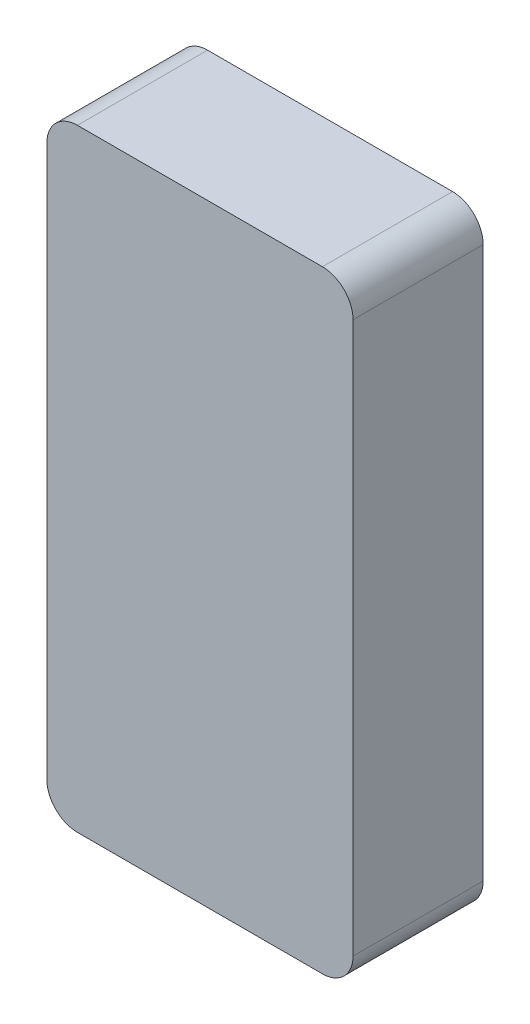
ISO-10303-21;
HEADER;
FILE_DESCRIPTION(('STEP AP214'),'2;1');
FILE_NAME('part.step','',(''),(''),'','','');
FILE_SCHEMA(('AUTOMOTIVE_DESIGN { 1 0 10303 214 1 1 1 1 }'));
ENDSEC;
DATA;
#1=APPLICATION_CONTEXT('core data for automotive mechanical design processes');
#2=APPLICATION_PROTOCOL_DEFINITION('international standard','automotive_design',2000,#1);
#3=PRODUCT_CONTEXT('',#1,'mechanical');
#4=PRODUCT('Part','Part','',(#3));
#5=PRODUCT_RELATED_PRODUCT_CATEGORY('part','',(#4));
#6=PRODUCT_DEFINITION_FORMATION('','',#4);
#7=PRODUCT_DEFINITION_CONTEXT('part definition',#1,'design');
#8=PRODUCT_DEFINITION('design','',#6,#7);
#9=PRODUCT_DEFINITION_SHAPE('','',#8);
#10=(LENGTH_UNIT() NAMED_UNIT(*) SI_UNIT(.MILLI.,.METRE.));
#11=(NAMED_UNIT(*) PLANE_ANGLE_UNIT() SI_UNIT($,.RADIAN.));
#12=(NAMED_UNIT(*) SI_UNIT($,.STERADIAN.) SOLID_ANGLE_UNIT());
#13=UNCERTAINTY_MEASURE_WITH_UNIT(LENGTH_MEASURE(1.E-05),#10,'distance_accuracy_value','');
#14=(GEOMETRIC_REPRESENTATION_CONTEXT(3) GLOBAL_UNCERTAINTY_ASSIGNED_CONTEXT((#13)) GLOBAL_UNIT_ASSIGNED_CONTEXT((#10,
#11,#12)) REPRESENTATION_CONTEXT('',''));
#15=CARTESIAN_POINT('',(0.,0.,0.));
#16=DIRECTION('',(0.,0.,1.));
#17=DIRECTION('',(1.,0.,0.));
#18=AXIS2_PLACEMENT_3D('',#15,#16,#17);
#19=CARTESIAN_POINT('',(-10.,20.,8.5));
#20=DIRECTION('',(1.,0.,0.));
#21=DIRECTION('',(0.,0.,-1.));
#22=AXIS2_PLACEMENT_3D('',#19,#20,#21);
#23=PLANE('',#22);
#24=DIRECTION('',(0.,-1.,0.));
#25=VECTOR('',#24,1.);
#26=CARTESIAN_POINT('',(-10.,20.,0.));
#27=LINE('',#26,#25);
#28=CARTESIAN_POINT('',(-10.,18.,0.));
#29=VERTEX_POINT('',#28);
#30=CARTESIAN_POINT('',(-10.,-18.,0.));
#31=VERTEX_POINT('',#30);
#32=EDGE_CURVE('E124',#29,#31,#27,.T.);
#33=ORIENTED_EDGE('',*,*,#32,.T.);
#34=DIRECTION('',(0.,0.,-1.));
#35=VECTOR('',#34,1.);
#36=CARTESIAN_POINT('',(-10.,-18.,8.5));
#37=LINE('',#36,#35);
#38=CARTESIAN_POINT('',(-10.,-18.,8.5));
#39=VERTEX_POINT('',#38);
#40=EDGE_CURVE('E102',#31,#39,#37,.F.);
#41=ORIENTED_EDGE('',*,*,#40,.T.);
#42=DIRECTION('',(0.,-1.,0.));
#43=VECTOR('',#42,1.);
#44=CARTESIAN_POINT('',(-10.,20.,8.5));
#45=LINE('',#44,#43);
#46=CARTESIAN_POINT('',(-10.,18.,8.5));
#47=VERTEX_POINT('',#46);
#48=EDGE_CURVE('E133',#47,#39,#45,.T.);
#49=ORIENTED_EDGE('',*,*,#48,.F.);
#50=DIRECTION('',(0.,0.,-1.));
#51=VECTOR('',#50,1.);
#52=CARTESIAN_POINT('',(-10.,18.,8.5));
#53=LINE('',#52,#51);
#54=EDGE_CURVE('E107',#47,#29,#53,.T.);
#55=ORIENTED_EDGE('',*,*,#54,.T.);
#56=EDGE_LOOP('',(#33,#41,#49,#55));
#57=FACE_BOUND('',#56,.T.);
#58=ADVANCED_FACE('F32',(#57),#23,.F.);
#59=CARTESIAN_POINT('',(-10.,-20.,8.5));
#60=DIRECTION('',(0.,1.,0.));
#61=DIRECTION('',(0.,0.,1.));
#62=AXIS2_PLACEMENT_3D('',#59,#60,#61);
#63=PLANE('',#62);
#64=DIRECTION('',(1.,0.,0.));
#65=VECTOR('',#64,1.);
#66=CARTESIAN_POINT('',(-10.,-20.,8.5));
#67=LINE('',#66,#65);
#68=CARTESIAN_POINT('',(-8.,-20.,8.5));
#69=VERTEX_POINT('',#68);
#70=CARTESIAN_POINT('',(8.,-20.,8.5));
#71=VERTEX_POINT('',#70);
#72=EDGE_CURVE('E117',#69,#71,#67,.T.);
#73=ORIENTED_EDGE('',*,*,#72,.F.);
#74=DIRECTION('',(0.,0.,-1.));
#75=VECTOR('',#74,1.);
#76=CARTESIAN_POINT('',(-8.,-20.,8.5));
#77=LINE('',#76,#75);
#78=CARTESIAN_POINT('',(-8.,-20.,0.));
#79=VERTEX_POINT('',#78);
#80=EDGE_CURVE('E101',#69,#79,#77,.T.);
#81=ORIENTED_EDGE('',*,*,#80,.T.);
#82=DIRECTION('',(1.,0.,0.));
#83=VECTOR('',#82,1.);
#84=CARTESIAN_POINT('',(-10.,-20.,0.));
#85=LINE('',#84,#83);
#86=CARTESIAN_POINT('',(8.,-20.,0.));
#87=VERTEX_POINT('',#86);
#88=EDGE_CURVE('E114',#79,#87,#85,.T.);
#89=ORIENTED_EDGE('',*,*,#88,.T.);
#90=DIRECTION('',(0.,0.,-1.));
#91=VECTOR('',#90,1.);
#92=CARTESIAN_POINT('',(8.,-20.,8.5));
#93=LINE('',#92,#91);
#94=EDGE_CURVE('E119',#87,#71,#93,.F.);
#95=ORIENTED_EDGE('',*,*,#94,.T.);
#96=EDGE_LOOP('',(#73,#81,#89,#95));
#97=FACE_BOUND('',#96,.T.);
#98=ADVANCED_FACE('F113',(#97),#63,.F.);
#99=CARTESIAN_POINT('',(10.,20.,8.5));
#100=DIRECTION('',(-1.,0.,0.));
#101=DIRECTION('',(0.,0.,1.));
#102=AXIS2_PLACEMENT_3D('',#99,#100,#101);
#103=PLANE('',#102);
#104=DIRECTION('',(0.,1.,0.));
#105=VECTOR('',#104,1.);
#106=CARTESIAN_POINT('',(10.,20.,8.5));
#107=LINE('',#106,#105);
#108=CARTESIAN_POINT('',(10.,-18.,8.5));
#109=VERTEX_POINT('',#108);
#110=CARTESIAN_POINT('',(10.,18.,8.5));
#111=VERTEX_POINT('',#110);
#112=EDGE_CURVE('E167',#109,#111,#107,.T.);
#113=ORIENTED_EDGE('',*,*,#112,.F.);
#114=DIRECTION('',(0.,0.,-1.));
#115=VECTOR('',#114,1.);
#116=CARTESIAN_POINT('',(10.,-18.,8.5));
#117=LINE('',#116,#115);
#118=CARTESIAN_POINT('',(10.,-18.,0.));
#119=VERTEX_POINT('',#118);
#120=EDGE_CURVE('E152',#109,#119,#117,.T.);
#121=ORIENTED_EDGE('',*,*,#120,.T.);
#122=DIRECTION('',(0.,1.,0.));
#123=VECTOR('',#122,1.);
#124=CARTESIAN_POINT('',(10.,20.,0.));
#125=LINE('',#124,#123);
#126=CARTESIAN_POINT('',(10.,18.,0.));
#127=VERTEX_POINT('',#126);
#128=EDGE_CURVE('E123',#119,#127,#125,.T.);
#129=ORIENTED_EDGE('',*,*,#128,.T.);
#130=DIRECTION('',(0.,0.,-1.));
#131=VECTOR('',#130,1.);
#132=CARTESIAN_POINT('',(10.,18.,8.5));
#133=LINE('',#132,#131);
#134=EDGE_CURVE('E150',#127,#111,#133,.F.);
#135=ORIENTED_EDGE('',*,*,#134,.T.);
#136=EDGE_LOOP('',(#113,#121,#129,#135));
#137=FACE_BOUND('',#136,.T.);
#138=ADVANCED_FACE('F178',(#137),#103,.F.);
#139=CARTESIAN_POINT('',(-10.,20.,8.5));
#140=DIRECTION('',(0.,-1.,0.));
#141=DIRECTION('',(0.,0.,-1.));
#142=AXIS2_PLACEMENT_3D('',#139,#140,#141);
#143=PLANE('',#142);
#144=DIRECTION('',(-1.,0.,0.));
#145=VECTOR('',#144,1.);
#146=CARTESIAN_POINT('',(-10.,20.,0.));
#147=LINE('',#146,#145);
#148=CARTESIAN_POINT('',(8.,20.,0.));
#149=VERTEX_POINT('',#148);
#150=CARTESIAN_POINT('',(-8.,20.,0.));
#151=VERTEX_POINT('',#150);
#152=EDGE_CURVE('E127',#149,#151,#147,.T.);
#153=ORIENTED_EDGE('',*,*,#152,.T.);
#154=DIRECTION('',(0.,0.,-1.));
#155=VECTOR('',#154,1.);
#156=CARTESIAN_POINT('',(-8.,20.,8.5));
#157=LINE('',#156,#155);
#158=CARTESIAN_POINT('',(-8.,20.,8.5));
#159=VERTEX_POINT('',#158);
#160=EDGE_CURVE('E11',#151,#159,#157,.F.);
#161=ORIENTED_EDGE('',*,*,#160,.T.);
#162=DIRECTION('',(-1.,0.,0.));
#163=VECTOR('',#162,1.);
#164=CARTESIAN_POINT('',(-10.,20.,8.5));
#165=LINE('',#164,#163);
#166=CARTESIAN_POINT('',(8.,20.,8.5));
#167=VERTEX_POINT('',#166);
#168=EDGE_CURVE('E134',#167,#159,#165,.T.);
#169=ORIENTED_EDGE('',*,*,#168,.F.);
#170=DIRECTION('',(0.,0.,-1.));
#171=VECTOR('',#170,1.);
#172=CARTESIAN_POINT('',(8.,20.,8.5));
#173=LINE('',#172,#171);
#174=EDGE_CURVE('E40',#167,#149,#173,.T.);
#175=ORIENTED_EDGE('',*,*,#174,.T.);
#176=EDGE_LOOP('',(#153,#161,#169,#175));
#177=FACE_BOUND('',#176,.T.);
#178=ADVANCED_FACE('F157',(#177),#143,.F.);
#179=CARTESIAN_POINT('',(0.,0.,8.5));
#180=DIRECTION('',(0.,0.,1.));
#181=DIRECTION('',(1.,0.,0.));
#182=AXIS2_PLACEMENT_3D('',#179,#180,#181);
#183=PLANE('',#182);
#184=ORIENTED_EDGE('',*,*,#48,.T.);
#185=CARTESIAN_POINT('',(-8.,-18.,8.5));
#186=DIRECTION('',(0.,0.,1.));
#187=DIRECTION('',(1.,0.,0.));
#188=AXIS2_PLACEMENT_3D('',#185,#186,#187);
#189=CIRCLE('',#188,2.);
#190=EDGE_CURVE('E148',#39,#69,#189,.T.);
#191=ORIENTED_EDGE('',*,*,#190,.T.);
#192=ORIENTED_EDGE('',*,*,#72,.T.);
#193=CARTESIAN_POINT('',(8.,-18.,8.5));
#194=DIRECTION('',(0.,0.,1.));
#195=DIRECTION('',(1.,0.,0.));
#196=AXIS2_PLACEMENT_3D('',#193,#194,#195);
#197=CIRCLE('',#196,2.);
#198=EDGE_CURVE('E146',#71,#109,#197,.T.);
#199=ORIENTED_EDGE('',*,*,#198,.T.);
#200=ORIENTED_EDGE('',*,*,#112,.T.);
#201=CARTESIAN_POINT('',(8.,18.,8.5));
#202=DIRECTION('',(0.,0.,1.));
#203=DIRECTION('',(1.,0.,0.));
#204=AXIS2_PLACEMENT_3D('',#201,#202,#203);
#205=CIRCLE('',#204,2.);
#206=EDGE_CURVE('E52',#111,#167,#205,.T.);
#207=ORIENTED_EDGE('',*,*,#206,.T.);
#208=ORIENTED_EDGE('',*,*,#168,.T.);
#209=CARTESIAN_POINT('',(-8.,18.,8.5));
#210=DIRECTION('',(0.,0.,1.));
#211=DIRECTION('',(1.,0.,0.));
#212=AXIS2_PLACEMENT_3D('',#209,#210,#211);
#213=CIRCLE('',#212,2.);
#214=EDGE_CURVE('E144',#159,#47,#213,.T.);
#215=ORIENTED_EDGE('',*,*,#214,.T.);
#216=EDGE_LOOP('',(#184,#191,#192,#199,#200,#207,#208,#215));
#217=FACE_BOUND('',#216,.T.);
#218=ADVANCED_FACE('F170',(#217),#183,.T.);
#219=CARTESIAN_POINT('',(0.,0.,0.));
#220=DIRECTION('',(0.,0.,1.));
#221=DIRECTION('',(1.,0.,0.));
#222=AXIS2_PLACEMENT_3D('',#219,#220,#221);
#223=PLANE('',#222);
#224=ORIENTED_EDGE('',*,*,#88,.F.);
#225=CARTESIAN_POINT('',(-8.,-18.,0.));
#226=DIRECTION('',(0.,0.,1.));
#227=DIRECTION('',(1.,0.,0.));
#228=AXIS2_PLACEMENT_3D('',#225,#226,#227);
#229=CIRCLE('',#228,2.);
#230=EDGE_CURVE('E97',#79,#31,#229,.F.);
#231=ORIENTED_EDGE('',*,*,#230,.T.);
#232=ORIENTED_EDGE('',*,*,#32,.F.);
#233=CARTESIAN_POINT('',(-8.,18.,0.));
#234=DIRECTION('',(0.,0.,1.));
#235=DIRECTION('',(1.,0.,0.));
#236=AXIS2_PLACEMENT_3D('',#233,#234,#235);
#237=CIRCLE('',#236,2.);
#238=EDGE_CURVE('E137',#29,#151,#237,.F.);
#239=ORIENTED_EDGE('',*,*,#238,.T.);
#240=ORIENTED_EDGE('',*,*,#152,.F.);
#241=CARTESIAN_POINT('',(8.,18.,0.));
#242=DIRECTION('',(0.,0.,1.));
#243=DIRECTION('',(1.,0.,0.));
#244=AXIS2_PLACEMENT_3D('',#241,#242,#243);
#245=CIRCLE('',#244,2.);
#246=EDGE_CURVE('E118',#149,#127,#245,.F.);
#247=ORIENTED_EDGE('',*,*,#246,.T.);
#248=ORIENTED_EDGE('',*,*,#128,.F.);
#249=CARTESIAN_POINT('',(8.,-18.,0.));
#250=DIRECTION('',(0.,0.,1.));
#251=DIRECTION('',(1.,0.,0.));
#252=AXIS2_PLACEMENT_3D('',#249,#250,#251);
#253=CIRCLE('',#252,2.);
#254=EDGE_CURVE('E108',#119,#87,#253,.F.);
#255=ORIENTED_EDGE('',*,*,#254,.T.);
#256=EDGE_LOOP('',(#224,#231,#232,#239,#240,#247,#248,#255));
#257=FACE_BOUND('',#256,.T.);
#258=ADVANCED_FACE('F121',(#257),#223,.F.);
#259=CARTESIAN_POINT('',(-8.,-18.,8.5));
#260=DIRECTION('',(0.,0.,-1.));
#261=DIRECTION('',(-1.,0.,0.));
#262=AXIS2_PLACEMENT_3D('',#259,#260,#261);
#263=CYLINDRICAL_SURFACE('',#262,2.);
#264=ORIENTED_EDGE('',*,*,#190,.F.);
#265=ORIENTED_EDGE('',*,*,#40,.F.);
#266=ORIENTED_EDGE('',*,*,#230,.F.);
#267=ORIENTED_EDGE('',*,*,#80,.F.);
#268=EDGE_LOOP('',(#264,#265,#266,#267));
#269=FACE_BOUND('',#268,.T.);
#270=ADVANCED_FACE('F100',(#269),#263,.T.);
#271=CARTESIAN_POINT('',(8.,-18.,8.5));
#272=DIRECTION('',(0.,0.,-1.));
#273=DIRECTION('',(-1.,0.,0.));
#274=AXIS2_PLACEMENT_3D('',#271,#272,#273);
#275=CYLINDRICAL_SURFACE('',#274,2.);
#276=ORIENTED_EDGE('',*,*,#198,.F.);
#277=ORIENTED_EDGE('',*,*,#94,.F.);
#278=ORIENTED_EDGE('',*,*,#254,.F.);
#279=ORIENTED_EDGE('',*,*,#120,.F.);
#280=EDGE_LOOP('',(#276,#277,#278,#279));
#281=FACE_BOUND('',#280,.T.);
#282=ADVANCED_FACE('F190',(#281),#275,.T.);
#283=CARTESIAN_POINT('',(-8.,18.,8.5));
#284=DIRECTION('',(0.,0.,-1.));
#285=DIRECTION('',(-1.,0.,0.));
#286=AXIS2_PLACEMENT_3D('',#283,#284,#285);
#287=CYLINDRICAL_SURFACE('',#286,2.);
#288=ORIENTED_EDGE('',*,*,#214,.F.);
#289=ORIENTED_EDGE('',*,*,#160,.F.);
#290=ORIENTED_EDGE('',*,*,#238,.F.);
#291=ORIENTED_EDGE('',*,*,#54,.F.);
#292=EDGE_LOOP('',(#288,#289,#290,#291));
#293=FACE_BOUND('',#292,.T.);
#294=ADVANCED_FACE('F162',(#293),#287,.T.);
#295=CARTESIAN_POINT('',(8.,18.,8.5));
#296=DIRECTION('',(0.,0.,-1.));
#297=DIRECTION('',(-1.,0.,0.));
#298=AXIS2_PLACEMENT_3D('',#295,#296,#297);
#299=CYLINDRICAL_SURFACE('',#298,2.);
#300=ORIENTED_EDGE('',*,*,#206,.F.);
#301=ORIENTED_EDGE('',*,*,#134,.F.);
#302=ORIENTED_EDGE('',*,*,#246,.F.);
#303=ORIENTED_EDGE('',*,*,#174,.F.);
#304=EDGE_LOOP('',(#300,#301,#302,#303));
#305=FACE_BOUND('',#304,.T.);
#306=ADVANCED_FACE('F34',(#305),#299,.T.);
#307=CLOSED_SHELL('',(#58,#98,#138,#178,#218,#258,#270,#282,#294,#306));
#308=MANIFOLD_SOLID_BREP('B2',#307);
#309=ADVANCED_BREP_SHAPE_REPRESENTATION('',(#18,#308),#14);
#310=SHAPE_DEFINITION_REPRESENTATION(#9,#309);
ENDSEC;
END-ISO-10303-21;
